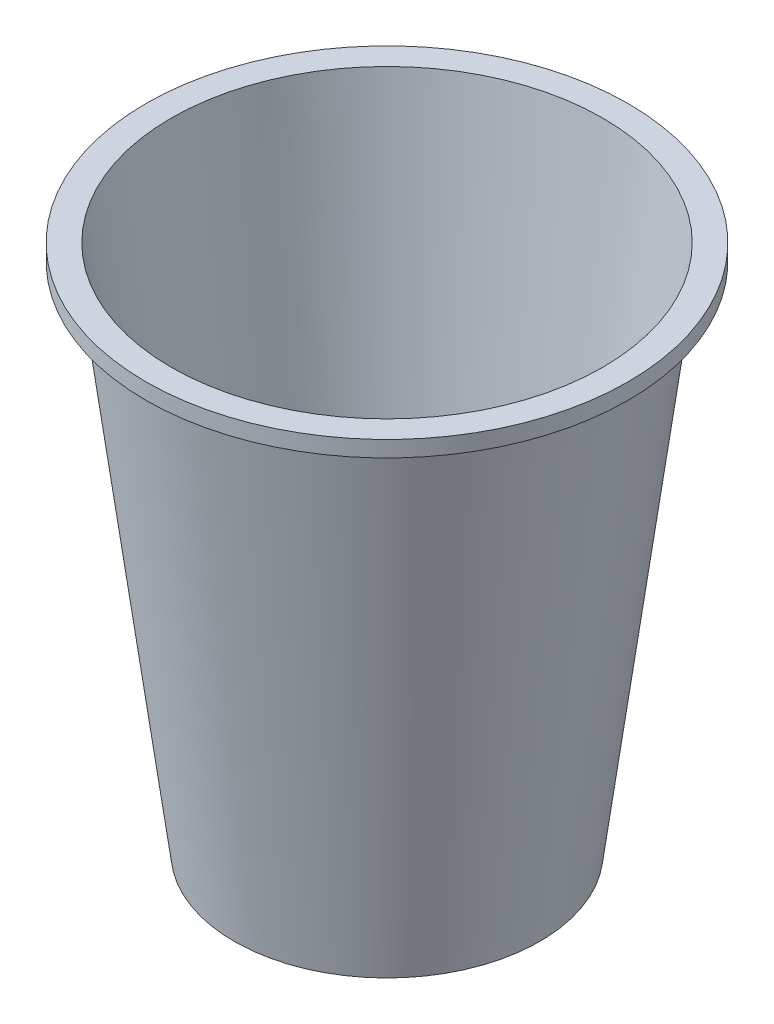
ISO-10303-21;
HEADER;
FILE_DESCRIPTION(('STEP AP214'),'2;1');
FILE_NAME('part.step','',(''),(''),'','','');
FILE_SCHEMA(('AUTOMOTIVE_DESIGN { 1 0 10303 214 1 1 1 1 }'));
ENDSEC;
DATA;
#1=APPLICATION_CONTEXT('core data for automotive mechanical design processes');
#2=APPLICATION_PROTOCOL_DEFINITION('international standard','automotive_design',2000,#1);
#3=PRODUCT_CONTEXT('',#1,'mechanical');
#4=PRODUCT('Part','Part','',(#3));
#5=PRODUCT_RELATED_PRODUCT_CATEGORY('part','',(#4));
#6=PRODUCT_DEFINITION_FORMATION('','',#4);
#7=PRODUCT_DEFINITION_CONTEXT('part definition',#1,'design');
#8=PRODUCT_DEFINITION('design','',#6,#7);
#9=PRODUCT_DEFINITION_SHAPE('','',#8);
#10=(LENGTH_UNIT() NAMED_UNIT(*) SI_UNIT(.MILLI.,.METRE.));
#11=(NAMED_UNIT(*) PLANE_ANGLE_UNIT() SI_UNIT($,.RADIAN.));
#12=(NAMED_UNIT(*) SI_UNIT($,.STERADIAN.) SOLID_ANGLE_UNIT());
#13=UNCERTAINTY_MEASURE_WITH_UNIT(LENGTH_MEASURE(1.E-05),#10,'distance_accuracy_value','');
#14=(GEOMETRIC_REPRESENTATION_CONTEXT(3) GLOBAL_UNCERTAINTY_ASSIGNED_CONTEXT((#13)) GLOBAL_UNIT_ASSIGNED_CONTEXT((#10,
#11,#12)) REPRESENTATION_CONTEXT('',''));
#15=CARTESIAN_POINT('',(0.,0.,0.));
#16=DIRECTION('',(0.,0.,1.));
#17=DIRECTION('',(1.,0.,0.));
#18=AXIS2_PLACEMENT_3D('',#15,#16,#17);
#19=CARTESIAN_POINT('',(45.5,109.,0.));
#20=DIRECTION('',(0.,-1.,0.));
#21=DIRECTION('',(1.,0.,0.));
#22=AXIS2_PLACEMENT_3D('',#19,#20,#21);
#23=PLANE('',#22);
#24=CARTESIAN_POINT('',(0.,109.,0.));
#25=DIRECTION('',(0.,-1.,0.));
#26=DIRECTION('',(1.,0.,0.));
#27=AXIS2_PLACEMENT_3D('',#24,#25,#26);
#28=CIRCLE('',#27,44.4917852769037);
#29=CARTESIAN_POINT('',(44.4917852769038,109.,0.));
#30=VERTEX_POINT('',#29);
#31=EDGE_CURVE('E45',#30,#30,#28,.F.);
#32=ORIENTED_EDGE('',*,*,#31,.F.);
#33=EDGE_LOOP('',(#32));
#34=FACE_BOUND('',#33,.T.);
#35=CARTESIAN_POINT('',(0.,109.,0.));
#36=DIRECTION('',(0.,1.,0.));
#37=DIRECTION('',(-1.,0.,0.));
#38=AXIS2_PLACEMENT_3D('',#35,#36,#37);
#39=CIRCLE('',#38,49.69);
#40=CARTESIAN_POINT('',(-49.69,109.,0.));
#41=VERTEX_POINT('',#40);
#42=EDGE_CURVE('E51',#41,#41,#39,.T.);
#43=ORIENTED_EDGE('',*,*,#42,.T.);
#44=EDGE_LOOP('',(#43));
#45=FACE_BOUND('',#44,.T.);
#46=ADVANCED_FACE('F30',(#34,#45),#23,.F.);
#47=CARTESIAN_POINT('',(0.,1.,0.));
#48=DIRECTION('',(0.,1.,0.));
#49=DIRECTION('',(-1.,0.,0.));
#50=AXIS2_PLACEMENT_3D('',#47,#48,#49);
#51=PLANE('',#50);
#52=CARTESIAN_POINT('',(0.,1.,0.));
#53=DIRECTION('',(0.,1.,0.));
#54=DIRECTION('',(-1.,0.,0.));
#55=AXIS2_PLACEMENT_3D('',#52,#53,#54);
#56=CIRCLE('',#55,30.6202256438762);
#57=CARTESIAN_POINT('',(-30.6202256438762,1.00000000000001,0.));
#58=VERTEX_POINT('',#57);
#59=EDGE_CURVE('E41',#58,#58,#56,.T.);
#60=ORIENTED_EDGE('',*,*,#59,.T.);
#61=EDGE_LOOP('',(#60));
#62=FACE_BOUND('',#61,.T.);
#63=ADVANCED_FACE('F72',(#62),#51,.T.);
#64=CARTESIAN_POINT('',(0.,0.127393861674659,0.));
#65=DIRECTION('',(0.,1.,0.));
#66=DIRECTION('',(-1.,0.,0.));
#67=AXIS2_PLACEMENT_3D('',#64,#65,#66);
#68=CONICAL_SURFACE('',#67,30.5081477912473,0.127740986121312);
#69=ORIENTED_EDGE('',*,*,#31,.T.);
#70=EDGE_LOOP('',(#69));
#71=FACE_BOUND('',#70,.T.);
#72=ORIENTED_EDGE('',*,*,#59,.F.);
#73=EDGE_LOOP('',(#72));
#74=FACE_BOUND('',#73,.T.);
#75=ADVANCED_FACE('F69',(#71,#74),#68,.F.);
#76=CARTESIAN_POINT('',(0.,105.7,0.));
#77=DIRECTION('',(0.,1.,0.));
#78=DIRECTION('',(-1.,0.,0.));
#79=AXIS2_PLACEMENT_3D('',#76,#77,#78);
#80=CYLINDRICAL_SURFACE('',#79,49.69);
#81=CARTESIAN_POINT('',(0.,105.7,0.));
#82=DIRECTION('',(0.,1.,0.));
#83=DIRECTION('',(-1.,0.,0.));
#84=AXIS2_PLACEMENT_3D('',#81,#82,#83);
#85=CIRCLE('',#84,49.69);
#86=CARTESIAN_POINT('',(-49.69,105.7,0.));
#87=VERTEX_POINT('',#86);
#88=EDGE_CURVE('E49',#87,#87,#85,.T.);
#89=ORIENTED_EDGE('',*,*,#88,.T.);
#90=EDGE_LOOP('',(#89));
#91=FACE_BOUND('',#90,.T.);
#92=ORIENTED_EDGE('',*,*,#42,.F.);
#93=EDGE_LOOP('',(#92));
#94=FACE_BOUND('',#93,.T.);
#95=ADVANCED_FACE('F57',(#91,#94),#80,.T.);
#96=CARTESIAN_POINT('',(0.,105.7,0.));
#97=DIRECTION('',(0.,1.,0.));
#98=DIRECTION('',(-1.,0.,0.));
#99=AXIS2_PLACEMENT_3D('',#96,#97,#98);
#100=PLANE('',#99);
#101=CARTESIAN_POINT('',(0.,105.7,0.));
#102=DIRECTION('',(0.,1.,0.));
#103=DIRECTION('',(-1.,0.,0.));
#104=AXIS2_PLACEMENT_3D('',#101,#102,#103);
#105=CIRCLE('',#104,45.0761467889908);
#106=CARTESIAN_POINT('',(-45.0761467889908,105.7,0.));
#107=VERTEX_POINT('',#106);
#108=EDGE_CURVE('E10',#107,#107,#105,.T.);
#109=ORIENTED_EDGE('',*,*,#108,.T.);
#110=EDGE_LOOP('',(#109));
#111=FACE_BOUND('',#110,.T.);
#112=ORIENTED_EDGE('',*,*,#88,.F.);
#113=EDGE_LOOP('',(#112));
#114=FACE_BOUND('',#113,.T.);
#115=ADVANCED_FACE('F60',(#111,#114),#100,.F.);
#116=CARTESIAN_POINT('',(0.,0.,0.));
#117=DIRECTION('',(0.,1.,0.));
#118=DIRECTION('',(-1.,0.,0.));
#119=AXIS2_PLACEMENT_3D('',#116,#117,#118);
#120=PLANE('',#119);
#121=CARTESIAN_POINT('',(0.,0.,0.));
#122=DIRECTION('',(0.,1.,0.));
#123=DIRECTION('',(-1.,0.,0.));
#124=AXIS2_PLACEMENT_3D('',#121,#122,#123);
#125=CIRCLE('',#124,31.5);
#126=CARTESIAN_POINT('',(-31.5,0.,0.));
#127=VERTEX_POINT('',#126);
#128=EDGE_CURVE('E37',#127,#127,#125,.T.);
#129=ORIENTED_EDGE('',*,*,#128,.F.);
#130=EDGE_LOOP('',(#129));
#131=FACE_BOUND('',#130,.T.);
#132=ADVANCED_FACE('F32',(#131),#120,.F.);
#133=CARTESIAN_POINT('',(0.,0.,0.));
#134=DIRECTION('',(0.,1.,0.));
#135=DIRECTION('',(-1.,0.,0.));
#136=AXIS2_PLACEMENT_3D('',#133,#134,#135);
#137=CONICAL_SURFACE('',#136,31.5,0.127740986121312);
#138=ORIENTED_EDGE('',*,*,#128,.T.);
#139=EDGE_LOOP('',(#138));
#140=FACE_BOUND('',#139,.T.);
#141=ORIENTED_EDGE('',*,*,#108,.F.);
#142=EDGE_LOOP('',(#141));
#143=FACE_BOUND('',#142,.T.);
#144=ADVANCED_FACE('F67',(#140,#143),#137,.T.);
#145=CLOSED_SHELL('',(#46,#63,#75,#95,#115,#132,#144));
#146=MANIFOLD_SOLID_BREP('B2',#145);
#147=ADVANCED_BREP_SHAPE_REPRESENTATION('',(#18,#146),#14);
#148=SHAPE_DEFINITION_REPRESENTATION(#9,#147);
ENDSEC;
END-ISO-10303-21;
